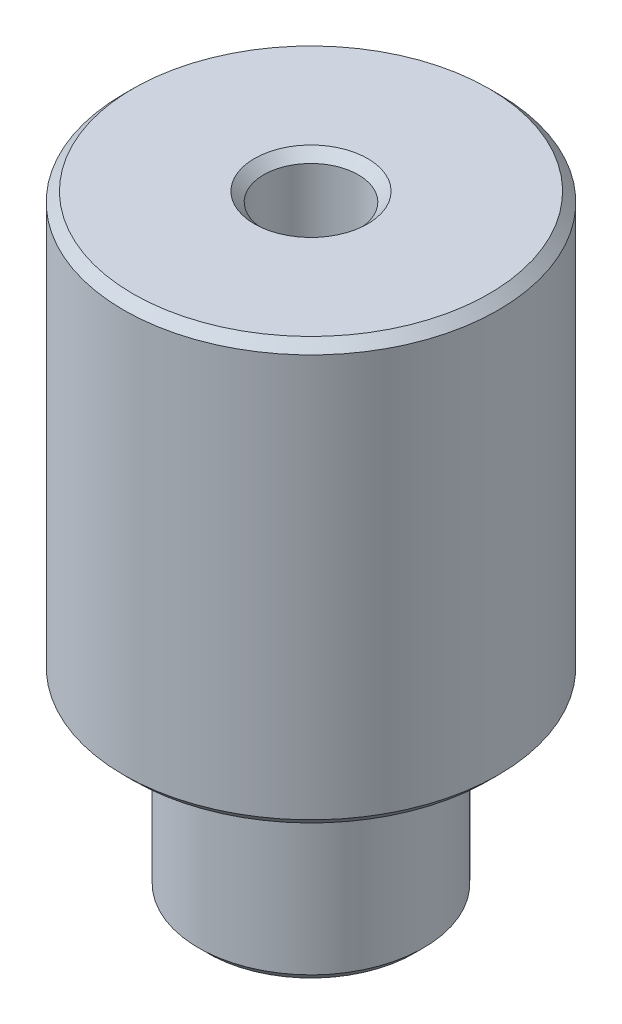
ISO-10303-21;
HEADER;
FILE_DESCRIPTION(('STEP AP214'),'2;1');
FILE_NAME('part.step','',(''),(''),'','','');
FILE_SCHEMA(('AUTOMOTIVE_DESIGN { 1 0 10303 214 1 1 1 1 }'));
ENDSEC;
DATA;
#1=APPLICATION_CONTEXT('core data for automotive mechanical design processes');
#2=APPLICATION_PROTOCOL_DEFINITION('international standard','automotive_design',2000,#1);
#3=PRODUCT_CONTEXT('',#1,'mechanical');
#4=PRODUCT('Part','Part','',(#3));
#5=PRODUCT_RELATED_PRODUCT_CATEGORY('part','',(#4));
#6=PRODUCT_DEFINITION_FORMATION('','',#4);
#7=PRODUCT_DEFINITION_CONTEXT('part definition',#1,'design');
#8=PRODUCT_DEFINITION('design','',#6,#7);
#9=PRODUCT_DEFINITION_SHAPE('','',#8);
#10=(LENGTH_UNIT() NAMED_UNIT(*) SI_UNIT(.MILLI.,.METRE.));
#11=(NAMED_UNIT(*) PLANE_ANGLE_UNIT() SI_UNIT($,.RADIAN.));
#12=(NAMED_UNIT(*) SI_UNIT($,.STERADIAN.) SOLID_ANGLE_UNIT());
#13=UNCERTAINTY_MEASURE_WITH_UNIT(LENGTH_MEASURE(1.E-05),#10,'distance_accuracy_value','');
#14=(GEOMETRIC_REPRESENTATION_CONTEXT(3) GLOBAL_UNCERTAINTY_ASSIGNED_CONTEXT((#13)) GLOBAL_UNIT_ASSIGNED_CONTEXT((#10,
#11,#12)) REPRESENTATION_CONTEXT('',''));
#15=CARTESIAN_POINT('',(0.,0.,0.));
#16=DIRECTION('',(0.,0.,1.));
#17=DIRECTION('',(1.,0.,0.));
#18=AXIS2_PLACEMENT_3D('',#15,#16,#17);
#19=CARTESIAN_POINT('',(0.,0.,0.));
#20=DIRECTION('',(0.,1.,0.));
#21=DIRECTION('',(0.,0.,1.));
#22=AXIS2_PLACEMENT_3D('',#19,#20,#21);
#23=PLANE('',#22);
#24=CARTESIAN_POINT('',(0.,0.,0.));
#25=DIRECTION('',(0.,1.,0.));
#26=DIRECTION('',(0.,0.,1.));
#27=AXIS2_PLACEMENT_3D('',#24,#25,#26);
#28=CIRCLE('',#27,6.05);
#29=CARTESIAN_POINT('',(0.,0.,6.05));
#30=VERTEX_POINT('',#29);
#31=EDGE_CURVE('E10',#30,#30,#28,.F.);
#32=ORIENTED_EDGE('',*,*,#31,.T.);
#33=EDGE_LOOP('',(#32));
#34=FACE_BOUND('',#33,.T.);
#35=CARTESIAN_POINT('',(0.,0.,0.));
#36=DIRECTION('',(0.,1.,0.));
#37=DIRECTION('',(0.,0.,1.));
#38=AXIS2_PLACEMENT_3D('',#35,#36,#37);
#39=CIRCLE('',#38,19.);
#40=CARTESIAN_POINT('',(0.,0.,19.));
#41=VERTEX_POINT('',#40);
#42=EDGE_CURVE('E49',#41,#41,#39,.T.);
#43=ORIENTED_EDGE('',*,*,#42,.T.);
#44=EDGE_LOOP('',(#43));
#45=FACE_BOUND('',#44,.T.);
#46=ADVANCED_FACE('F41',(#34,#45),#23,.T.);
#47=CARTESIAN_POINT('',(0.,-70.,0.));
#48=DIRECTION('',(0.,-1.,0.));
#49=DIRECTION('',(0.,0.,-1.));
#50=AXIS2_PLACEMENT_3D('',#47,#48,#49);
#51=CYLINDRICAL_SURFACE('',#50,20.);
#52=CARTESIAN_POINT('',(0.,-44.,0.));
#53=DIRECTION('',(0.,-1.,0.));
#54=DIRECTION('',(0.,0.,-1.));
#55=AXIS2_PLACEMENT_3D('',#52,#53,#54);
#56=CIRCLE('',#55,20.);
#57=CARTESIAN_POINT('',(0.,-44.,-20.));
#58=VERTEX_POINT('',#57);
#59=EDGE_CURVE('E53',#58,#58,#56,.F.);
#60=ORIENTED_EDGE('',*,*,#59,.T.);
#61=EDGE_LOOP('',(#60));
#62=FACE_BOUND('',#61,.T.);
#63=CARTESIAN_POINT('',(0.,-1.,0.));
#64=DIRECTION('',(0.,1.,0.));
#65=DIRECTION('',(0.,0.,1.));
#66=AXIS2_PLACEMENT_3D('',#63,#64,#65);
#67=CIRCLE('',#66,20.);
#68=CARTESIAN_POINT('',(0.,-1.,20.));
#69=VERTEX_POINT('',#68);
#70=EDGE_CURVE('E57',#69,#69,#67,.F.);
#71=ORIENTED_EDGE('',*,*,#70,.T.);
#72=EDGE_LOOP('',(#71));
#73=FACE_BOUND('',#72,.T.);
#74=ADVANCED_FACE('F88',(#62,#73),#51,.T.);
#75=CARTESIAN_POINT('',(20.,-45.,0.));
#76=DIRECTION('',(0.,-1.,0.));
#77=DIRECTION('',(0.,0.,-1.));
#78=AXIS2_PLACEMENT_3D('',#75,#76,#77);
#79=PLANE('',#78);
#80=CARTESIAN_POINT('',(0.,-45.,0.));
#81=DIRECTION('',(0.,-1.,0.));
#82=DIRECTION('',(0.,0.,-1.));
#83=AXIS2_PLACEMENT_3D('',#80,#81,#82);
#84=CIRCLE('',#83,19.);
#85=CARTESIAN_POINT('',(0.,-45.,-19.));
#86=VERTEX_POINT('',#85);
#87=EDGE_CURVE('E62',#86,#86,#84,.T.);
#88=ORIENTED_EDGE('',*,*,#87,.T.);
#89=EDGE_LOOP('',(#88));
#90=FACE_BOUND('',#89,.T.);
#91=CARTESIAN_POINT('',(0.,-45.,0.));
#92=DIRECTION('',(0.,-1.,0.));
#93=DIRECTION('',(0.,0.,-1.));
#94=AXIS2_PLACEMENT_3D('',#91,#92,#93);
#95=CIRCLE('',#94,12.);
#96=CARTESIAN_POINT('',(0.,-45.,-12.));
#97=VERTEX_POINT('',#96);
#98=EDGE_CURVE('E80',#97,#97,#95,.T.);
#99=ORIENTED_EDGE('',*,*,#98,.F.);
#100=EDGE_LOOP('',(#99));
#101=FACE_BOUND('',#100,.T.);
#102=ADVANCED_FACE('F86',(#90,#101),#79,.T.);
#103=CARTESIAN_POINT('',(0.,-70.,0.));
#104=DIRECTION('',(0.,-1.,0.));
#105=DIRECTION('',(0.,0.,-1.));
#106=AXIS2_PLACEMENT_3D('',#103,#104,#105);
#107=CYLINDRICAL_SURFACE('',#106,12.);
#108=CARTESIAN_POINT('',(0.,-64.,0.));
#109=DIRECTION('',(0.,-1.,0.));
#110=DIRECTION('',(0.,0.,-1.));
#111=AXIS2_PLACEMENT_3D('',#108,#109,#110);
#112=CIRCLE('',#111,12.);
#113=CARTESIAN_POINT('',(0.,-64.,-12.));
#114=VERTEX_POINT('',#113);
#115=EDGE_CURVE('E65',#114,#114,#112,.F.);
#116=ORIENTED_EDGE('',*,*,#115,.T.);
#117=EDGE_LOOP('',(#116));
#118=FACE_BOUND('',#117,.T.);
#119=ORIENTED_EDGE('',*,*,#98,.T.);
#120=EDGE_LOOP('',(#119));
#121=FACE_BOUND('',#120,.T.);
#122=ADVANCED_FACE('F84',(#118,#121),#107,.T.);
#123=CARTESIAN_POINT('',(12.,-65.,0.));
#124=DIRECTION('',(0.,-1.,0.));
#125=DIRECTION('',(0.,0.,-1.));
#126=AXIS2_PLACEMENT_3D('',#123,#124,#125);
#127=PLANE('',#126);
#128=CARTESIAN_POINT('',(0.,-65.,0.));
#129=DIRECTION('',(0.,-1.,0.));
#130=DIRECTION('',(0.,0.,-1.));
#131=AXIS2_PLACEMENT_3D('',#128,#129,#130);
#132=CIRCLE('',#131,6.05000000000001);
#133=CARTESIAN_POINT('',(0.,-65.,-6.05000000000001));
#134=VERTEX_POINT('',#133);
#135=EDGE_CURVE('E74',#134,#134,#132,.F.);
#136=ORIENTED_EDGE('',*,*,#135,.T.);
#137=EDGE_LOOP('',(#136));
#138=FACE_BOUND('',#137,.T.);
#139=CARTESIAN_POINT('',(0.,-65.,0.));
#140=DIRECTION('',(0.,-1.,0.));
#141=DIRECTION('',(0.,0.,-1.));
#142=AXIS2_PLACEMENT_3D('',#139,#140,#141);
#143=CIRCLE('',#142,11.);
#144=CARTESIAN_POINT('',(0.,-65.,-11.));
#145=VERTEX_POINT('',#144);
#146=EDGE_CURVE('E77',#145,#145,#143,.T.);
#147=ORIENTED_EDGE('',*,*,#146,.T.);
#148=EDGE_LOOP('',(#147));
#149=FACE_BOUND('',#148,.T.);
#150=ADVANCED_FACE('F95',(#138,#149),#127,.T.);
#151=CARTESIAN_POINT('',(0.,-65.,0.));
#152=DIRECTION('',(0.,1.,0.));
#153=DIRECTION('',(-1.,0.,0.));
#154=AXIS2_PLACEMENT_3D('',#151,#152,#153);
#155=CYLINDRICAL_SURFACE('',#154,5.05);
#156=CARTESIAN_POINT('',(0.,-64.,0.));
#157=DIRECTION('',(0.,-1.,0.));
#158=DIRECTION('',(1.,0.,0.));
#159=AXIS2_PLACEMENT_3D('',#156,#157,#158);
#160=CIRCLE('',#159,5.05);
#161=CARTESIAN_POINT('',(5.05,-64.,0.));
#162=VERTEX_POINT('',#161);
#163=EDGE_CURVE('E68',#162,#162,#160,.T.);
#164=ORIENTED_EDGE('',*,*,#163,.T.);
#165=EDGE_LOOP('',(#164));
#166=FACE_BOUND('',#165,.T.);
#167=CARTESIAN_POINT('',(0.,-1.,0.));
#168=DIRECTION('',(0.,1.,0.));
#169=DIRECTION('',(-1.,0.,0.));
#170=AXIS2_PLACEMENT_3D('',#167,#168,#169);
#171=CIRCLE('',#170,5.05);
#172=CARTESIAN_POINT('',(-5.05,-1.,0.));
#173=VERTEX_POINT('',#172);
#174=EDGE_CURVE('E71',#173,#173,#171,.T.);
#175=ORIENTED_EDGE('',*,*,#174,.T.);
#176=EDGE_LOOP('',(#175));
#177=FACE_BOUND('',#176,.T.);
#178=ADVANCED_FACE('F113',(#166,#177),#155,.F.);
#179=CARTESIAN_POINT('',(0.,-65.,0.));
#180=DIRECTION('',(0.,-1.,0.));
#181=DIRECTION('',(1.,0.,0.));
#182=AXIS2_PLACEMENT_3D('',#179,#180,#181);
#183=CONICAL_SURFACE('',#182,6.05000000000001,0.785398163397445);
#184=ORIENTED_EDGE('',*,*,#163,.F.);
#185=EDGE_LOOP('',(#184));
#186=FACE_BOUND('',#185,.T.);
#187=ORIENTED_EDGE('',*,*,#135,.F.);
#188=EDGE_LOOP('',(#187));
#189=FACE_BOUND('',#188,.T.);
#190=ADVANCED_FACE('F106',(#186,#189),#183,.F.);
#191=CARTESIAN_POINT('',(0.,-65.,0.));
#192=DIRECTION('',(0.,1.,0.));
#193=DIRECTION('',(0.,0.,1.));
#194=AXIS2_PLACEMENT_3D('',#191,#192,#193);
#195=CONICAL_SURFACE('',#194,11.,0.785398163397446);
#196=ORIENTED_EDGE('',*,*,#115,.F.);
#197=EDGE_LOOP('',(#196));
#198=FACE_BOUND('',#197,.T.);
#199=ORIENTED_EDGE('',*,*,#146,.F.);
#200=EDGE_LOOP('',(#199));
#201=FACE_BOUND('',#200,.T.);
#202=ADVANCED_FACE('F112',(#198,#201),#195,.T.);
#203=CARTESIAN_POINT('',(0.,-45.,0.));
#204=DIRECTION('',(0.,1.,0.));
#205=DIRECTION('',(0.,0.,1.));
#206=AXIS2_PLACEMENT_3D('',#203,#204,#205);
#207=CONICAL_SURFACE('',#206,19.,0.785398163397445);
#208=ORIENTED_EDGE('',*,*,#59,.F.);
#209=EDGE_LOOP('',(#208));
#210=FACE_BOUND('',#209,.T.);
#211=ORIENTED_EDGE('',*,*,#87,.F.);
#212=EDGE_LOOP('',(#211));
#213=FACE_BOUND('',#212,.T.);
#214=ADVANCED_FACE('F120',(#210,#213),#207,.T.);
#215=CARTESIAN_POINT('',(0.,-1.,0.));
#216=DIRECTION('',(0.,1.,0.));
#217=DIRECTION('',(-1.,0.,0.));
#218=AXIS2_PLACEMENT_3D('',#215,#216,#217);
#219=CONICAL_SURFACE('',#218,5.05,0.785398163397448);
#220=ORIENTED_EDGE('',*,*,#31,.F.);
#221=EDGE_LOOP('',(#220));
#222=FACE_BOUND('',#221,.T.);
#223=ORIENTED_EDGE('',*,*,#174,.F.);
#224=EDGE_LOOP('',(#223));
#225=FACE_BOUND('',#224,.T.);
#226=ADVANCED_FACE('F126',(#222,#225),#219,.F.);
#227=CARTESIAN_POINT('',(0.,-1.,0.));
#228=DIRECTION('',(0.,-1.,0.));
#229=DIRECTION('',(0.,0.,-1.));
#230=AXIS2_PLACEMENT_3D('',#227,#228,#229);
#231=CONICAL_SURFACE('',#230,20.,0.785398163397452);
#232=ORIENTED_EDGE('',*,*,#42,.F.);
#233=EDGE_LOOP('',(#232));
#234=FACE_BOUND('',#233,.T.);
#235=ORIENTED_EDGE('',*,*,#70,.F.);
#236=EDGE_LOOP('',(#235));
#237=FACE_BOUND('',#236,.T.);
#238=ADVANCED_FACE('F44',(#234,#237),#231,.T.);
#239=CLOSED_SHELL('',(#46,#74,#102,#122,#150,#178,#190,#202,#214,#226,#238));
#240=MANIFOLD_SOLID_BREP('B2',#239);
#241=ADVANCED_BREP_SHAPE_REPRESENTATION('',(#18,#240),#14);
#242=SHAPE_DEFINITION_REPRESENTATION(#9,#241);
ENDSEC;
END-ISO-10303-21;
